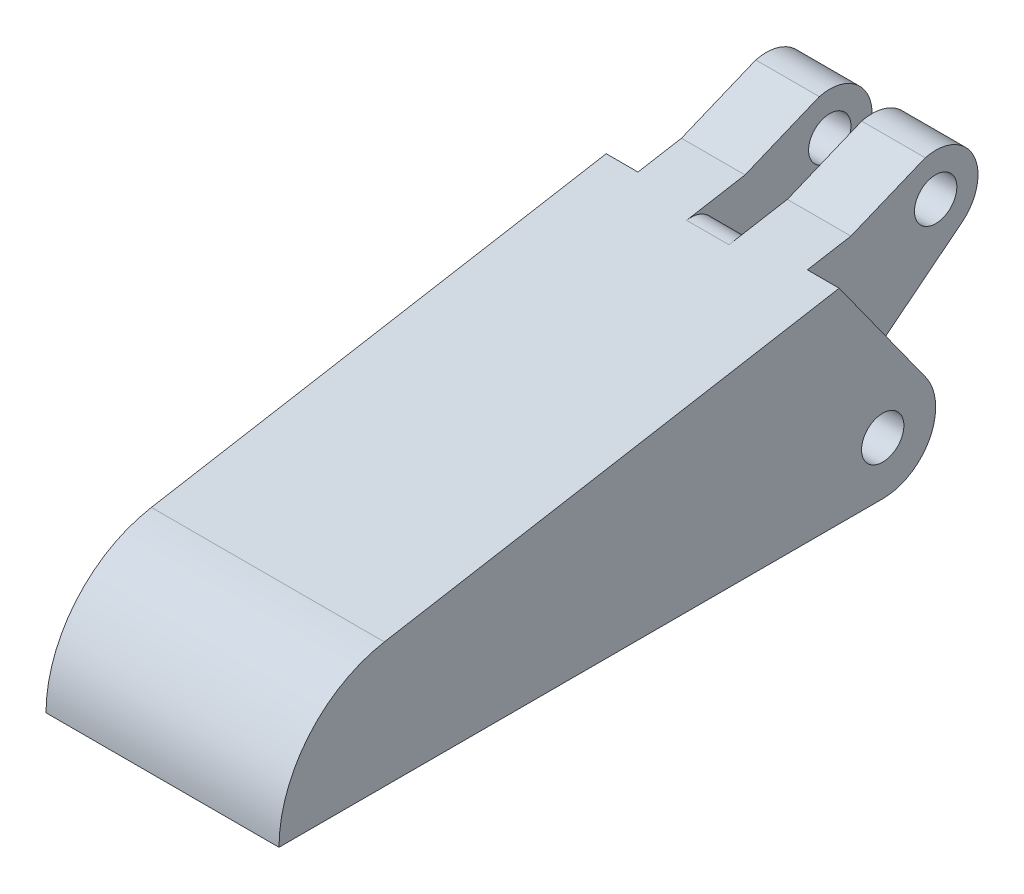
ISO-10303-21;
HEADER;
FILE_DESCRIPTION(('STEP AP214'),'2;1');
FILE_NAME('part.step','',(''),(''),'','','');
FILE_SCHEMA(('AUTOMOTIVE_DESIGN { 1 0 10303 214 1 1 1 1 }'));
ENDSEC;
DATA;
#1=APPLICATION_CONTEXT('core data for automotive mechanical design processes');
#2=APPLICATION_PROTOCOL_DEFINITION('international standard','automotive_design',2000,#1);
#3=PRODUCT_CONTEXT('',#1,'mechanical');
#4=PRODUCT('Part','Part','',(#3));
#5=PRODUCT_RELATED_PRODUCT_CATEGORY('part','',(#4));
#6=PRODUCT_DEFINITION_FORMATION('','',#4);
#7=PRODUCT_DEFINITION_CONTEXT('part definition',#1,'design');
#8=PRODUCT_DEFINITION('design','',#6,#7);
#9=PRODUCT_DEFINITION_SHAPE('','',#8);
#10=(LENGTH_UNIT() NAMED_UNIT(*) SI_UNIT(.MILLI.,.METRE.));
#11=(NAMED_UNIT(*) PLANE_ANGLE_UNIT() SI_UNIT($,.RADIAN.));
#12=(NAMED_UNIT(*) SI_UNIT($,.STERADIAN.) SOLID_ANGLE_UNIT());
#13=UNCERTAINTY_MEASURE_WITH_UNIT(LENGTH_MEASURE(1.E-05),#10,'distance_accuracy_value','');
#14=(GEOMETRIC_REPRESENTATION_CONTEXT(3) GLOBAL_UNCERTAINTY_ASSIGNED_CONTEXT((#13)) GLOBAL_UNIT_ASSIGNED_CONTEXT((#10,
#11,#12)) REPRESENTATION_CONTEXT('',''));
#15=CARTESIAN_POINT('',(0.,0.,0.));
#16=DIRECTION('',(0.,0.,1.));
#17=DIRECTION('',(1.,0.,0.));
#18=AXIS2_PLACEMENT_3D('',#15,#16,#17);
#19=CARTESIAN_POINT('',(3.,14.9837440028943,0.));
#20=DIRECTION('',(0.,0.924460532663595,0.381277751183231));
#21=DIRECTION('',(0.,-0.381277751183231,0.924460532663595));
#22=AXIS2_PLACEMENT_3D('',#19,#20,#21);
#23=PLANE('',#22);
#24=DIRECTION('',(1.,0.,0.));
#25=VECTOR('',#24,1.);
#26=CARTESIAN_POINT('',(3.,14.9837440028943,0.));
#27=LINE('',#26,#25);
#28=CARTESIAN_POINT('',(3.,14.9837440028943,0.));
#29=VERTEX_POINT('',#28);
#30=CARTESIAN_POINT('',(9.,14.9837440028943,0.));
#31=VERTEX_POINT('',#30);
#32=EDGE_CURVE('E295',#29,#31,#27,.T.);
#33=ORIENTED_EDGE('',*,*,#32,.T.);
#34=DIRECTION('',(0.,0.381277751183231,-0.924460532663595));
#35=VECTOR('',#34,1.);
#36=CARTESIAN_POINT('',(9.,14.9837440028943,0.));
#37=LINE('',#36,#35);
#38=CARTESIAN_POINT('',(9.,17.8766101294901,-7.01415320463333));
#39=VERTEX_POINT('',#38);
#40=EDGE_CURVE('E225',#31,#39,#37,.T.);
#41=ORIENTED_EDGE('',*,*,#40,.T.);
#42=DIRECTION('',(1.,0.,0.));
#43=VECTOR('',#42,1.);
#44=CARTESIAN_POINT('',(3.,17.8766101294901,-7.01415320463333));
#45=LINE('',#44,#43);
#46=CARTESIAN_POINT('',(3.,17.8766101294901,-7.01415320463333));
#47=VERTEX_POINT('',#46);
#48=EDGE_CURVE('E278',#47,#39,#45,.T.);
#49=ORIENTED_EDGE('',*,*,#48,.F.);
#50=DIRECTION('',(0.,-0.381277751183231,0.924460532663595));
#51=VECTOR('',#50,1.);
#52=CARTESIAN_POINT('',(3.,14.9837440028943,0.));
#53=LINE('',#52,#51);
#54=EDGE_CURVE('E259',#47,#29,#53,.T.);
#55=ORIENTED_EDGE('',*,*,#54,.T.);
#56=EDGE_LOOP('',(#33,#41,#49,#55));
#57=FACE_BOUND('',#56,.T.);
#58=ADVANCED_FACE('F44',(#57),#23,.T.);
#59=CARTESIAN_POINT('',(3.,14.,-8.));
#60=DIRECTION('',(1.,0.,0.));
#61=DIRECTION('',(0.,0.,-1.));
#62=AXIS2_PLACEMENT_3D('',#59,#60,#61);
#63=CYLINDRICAL_SURFACE('',#62,4.);
#64=ORIENTED_EDGE('',*,*,#48,.T.);
#65=CARTESIAN_POINT('',(9.,14.,-8.));
#66=DIRECTION('',(1.,0.,0.));
#67=DIRECTION('',(0.,0.,-1.));
#68=AXIS2_PLACEMENT_3D('',#65,#66,#67);
#69=CIRCLE('',#68,4.);
#70=CARTESIAN_POINT('',(9.,10.8656455942036,-10.4851202101437));
#71=VERTEX_POINT('',#70);
#72=EDGE_CURVE('E197',#71,#39,#69,.T.);
#73=ORIENTED_EDGE('',*,*,#72,.F.);
#74=DIRECTION('',(1.,0.,0.));
#75=VECTOR('',#74,1.);
#76=CARTESIAN_POINT('',(3.,10.8656455942036,-10.4851202101437));
#77=LINE('',#76,#75);
#78=CARTESIAN_POINT('',(3.,10.8656455942036,-10.4851202101437));
#79=VERTEX_POINT('',#78);
#80=EDGE_CURVE('E284',#79,#71,#77,.T.);
#81=ORIENTED_EDGE('',*,*,#80,.F.);
#82=CARTESIAN_POINT('',(3.,14.,-8.));
#83=DIRECTION('',(1.,0.,0.));
#84=DIRECTION('',(0.,0.,-1.));
#85=AXIS2_PLACEMENT_3D('',#82,#83,#84);
#86=CIRCLE('',#85,4.);
#87=EDGE_CURVE('E273',#79,#47,#86,.T.);
#88=ORIENTED_EDGE('',*,*,#87,.T.);
#89=EDGE_LOOP('',(#64,#73,#81,#88));
#90=FACE_BOUND('',#89,.T.);
#91=ADVANCED_FACE('F373',(#90),#63,.T.);
#92=CARTESIAN_POINT('',(3.,10.8656455942036,-10.4851202101437));
#93=DIRECTION('',(0.,-0.783588601449101,-0.621280052535926));
#94=DIRECTION('',(0.,0.621280052535926,-0.783588601449101));
#95=AXIS2_PLACEMENT_3D('',#92,#93,#94);
#96=PLANE('',#95);
#97=ORIENTED_EDGE('',*,*,#80,.T.);
#98=DIRECTION('',(0.,0.621280052535925,-0.783588601449101));
#99=VECTOR('',#98,1.);
#100=CARTESIAN_POINT('',(9.,10.8656455942036,-10.4851202101437));
#101=LINE('',#100,#99);
#102=CARTESIAN_POINT('',(9.,4.73290784629889,-2.75021326227114));
#103=VERTEX_POINT('',#102);
#104=EDGE_CURVE('E186',#103,#71,#101,.T.);
#105=ORIENTED_EDGE('',*,*,#104,.F.);
#106=DIRECTION('',(1.,0.,0.));
#107=VECTOR('',#106,1.);
#108=CARTESIAN_POINT('',(3.,4.73290784629889,-2.75021326227114));
#109=LINE('',#108,#107);
#110=CARTESIAN_POINT('',(3.,4.73290784629889,-2.75021326227114));
#111=VERTEX_POINT('',#110);
#112=EDGE_CURVE('E289',#111,#103,#109,.T.);
#113=ORIENTED_EDGE('',*,*,#112,.F.);
#114=DIRECTION('',(0.,0.621280052535926,-0.783588601449101));
#115=VECTOR('',#114,1.);
#116=CARTESIAN_POINT('',(3.,10.8656455942036,-10.4851202101437));
#117=LINE('',#116,#115);
#118=EDGE_CURVE('E70',#111,#79,#117,.T.);
#119=ORIENTED_EDGE('',*,*,#118,.T.);
#120=EDGE_LOOP('',(#97,#105,#113,#119));
#121=FACE_BOUND('',#120,.T.);
#122=ADVANCED_FACE('F362',(#121),#96,.T.);
#123=CARTESIAN_POINT('',(3.,14.,-8.));
#124=DIRECTION('',(1.,0.,0.));
#125=DIRECTION('',(0.,0.,-1.));
#126=AXIS2_PLACEMENT_3D('',#123,#124,#125);
#127=CYLINDRICAL_SURFACE('',#126,2.);
#128=CARTESIAN_POINT('',(3.,14.,-8.));
#129=DIRECTION('',(1.,0.,0.));
#130=DIRECTION('',(0.,0.,-1.));
#131=AXIS2_PLACEMENT_3D('',#128,#129,#130);
#132=CIRCLE('',#131,2.);
#133=CARTESIAN_POINT('',(3.,14.,-10.));
#134=VERTEX_POINT('',#133);
#135=EDGE_CURVE('E255',#134,#134,#132,.T.);
#136=ORIENTED_EDGE('',*,*,#135,.F.);
#137=EDGE_LOOP('',(#136));
#138=FACE_BOUND('',#137,.T.);
#139=CARTESIAN_POINT('',(9.,14.,-8.));
#140=DIRECTION('',(1.,0.,0.));
#141=DIRECTION('',(0.,0.,-1.));
#142=AXIS2_PLACEMENT_3D('',#139,#140,#141);
#143=CIRCLE('',#142,2.);
#144=CARTESIAN_POINT('',(9.,14.,-10.));
#145=VERTEX_POINT('',#144);
#146=EDGE_CURVE('E179',#145,#145,#143,.F.);
#147=ORIENTED_EDGE('',*,*,#146,.F.);
#148=EDGE_LOOP('',(#147));
#149=FACE_BOUND('',#148,.T.);
#150=ADVANCED_FACE('F359',(#138,#149),#127,.F.);
#151=CARTESIAN_POINT('',(22.,14.2713029002141,4.10781365998154));
#152=DIRECTION('',(0.,-0.583765439031886,0.811922356011897));
#153=DIRECTION('',(0.,-0.811922356011897,-0.583765439031886));
#154=AXIS2_PLACEMENT_3D('',#151,#152,#153);
#155=PLANE('',#154);
#156=DIRECTION('',(0.,-0.811922356011897,-0.583765439031886));
#157=VECTOR('',#156,1.);
#158=CARTESIAN_POINT('',(19.,4.73290784629889,-2.75021326227114));
#159=LINE('',#158,#157);
#160=CARTESIAN_POINT('',(19.,14.2713029002141,4.10781365998154));
#161=VERTEX_POINT('',#160);
#162=CARTESIAN_POINT('',(19.,4.73290784629889,-2.75021326227114));
#163=VERTEX_POINT('',#162);
#164=EDGE_CURVE('E243',#161,#163,#159,.T.);
#165=ORIENTED_EDGE('',*,*,#164,.F.);
#166=DIRECTION('',(-1.,0.,0.));
#167=VECTOR('',#166,1.);
#168=CARTESIAN_POINT('',(22.,14.2713029002141,4.10781365998154));
#169=LINE('',#168,#167);
#170=CARTESIAN_POINT('',(22.,14.2713029002141,4.10781365998154));
#171=VERTEX_POINT('',#170);
#172=EDGE_CURVE('E345',#171,#161,#169,.T.);
#173=ORIENTED_EDGE('',*,*,#172,.F.);
#174=DIRECTION('',(0.,0.811922356011895,0.583765439031889));
#175=VECTOR('',#174,1.);
#176=CARTESIAN_POINT('',(22.,2.75140008912451,-4.17490090296352));
#177=LINE('',#176,#175);
#178=CARTESIAN_POINT('',(22.,2.75140008912451,-4.17490090296352));
#179=VERTEX_POINT('',#178);
#180=EDGE_CURVE('E318',#179,#171,#177,.T.);
#181=ORIENTED_EDGE('',*,*,#180,.F.);
#182=DIRECTION('',(-1.,0.,0.));
#183=VECTOR('',#182,1.);
#184=CARTESIAN_POINT('',(22.,2.75140008912451,-4.17490090296352));
#185=LINE('',#184,#183);
#186=CARTESIAN_POINT('',(0.,2.75140008912451,-4.17490090296352));
#187=VERTEX_POINT('',#186);
#188=EDGE_CURVE('E349',#179,#187,#185,.T.);
#189=ORIENTED_EDGE('',*,*,#188,.T.);
#190=DIRECTION('',(0.,0.811922356011897,0.583765439031886));
#191=VECTOR('',#190,1.);
#192=CARTESIAN_POINT('',(0.,14.2713029002141,4.10781365998154));
#193=LINE('',#192,#191);
#194=CARTESIAN_POINT('',(0.,14.2713029002141,4.10781365998154));
#195=VERTEX_POINT('',#194);
#196=EDGE_CURVE('E335',#187,#195,#193,.T.);
#197=ORIENTED_EDGE('',*,*,#196,.T.);
#198=CARTESIAN_POINT('',(3.,14.2713029002141,4.10781365998154));
#199=VERTEX_POINT('',#198);
#200=EDGE_CURVE('E344',#199,#195,#169,.T.);
#201=ORIENTED_EDGE('',*,*,#200,.F.);
#202=DIRECTION('',(0.,-0.811922356011897,-0.583765439031886));
#203=VECTOR('',#202,1.);
#204=CARTESIAN_POINT('',(3.,4.73290784629889,-2.75021326227114));
#205=LINE('',#204,#203);
#206=EDGE_CURVE('E267',#199,#111,#205,.T.);
#207=ORIENTED_EDGE('',*,*,#206,.T.);
#208=ORIENTED_EDGE('',*,*,#112,.T.);
#209=CARTESIAN_POINT('',(13.,4.73290784629889,-2.75021326227114));
#210=VERTEX_POINT('',#209);
#211=EDGE_CURVE('E293',#103,#210,#109,.T.);
#212=ORIENTED_EDGE('',*,*,#211,.T.);
#213=EDGE_CURVE('E294',#210,#163,#109,.T.);
#214=ORIENTED_EDGE('',*,*,#213,.T.);
#215=EDGE_LOOP('',(#165,#173,#181,#189,#197,#201,#207,#208,#212,#214));
#216=FACE_BOUND('',#215,.T.);
#217=ADVANCED_FACE('F361',(#216),#155,.F.);
#218=CARTESIAN_POINT('',(22.,-5.,45.));
#219=DIRECTION('',(1.,0.,0.));
#220=DIRECTION('',(0.,0.,-1.));
#221=AXIS2_PLACEMENT_3D('',#218,#219,#220);
#222=PLANE('',#221);
#223=CARTESIAN_POINT('',(22.,-5.,45.));
#224=DIRECTION('',(1.,0.,0.));
#225=DIRECTION('',(0.,0.,-1.));
#226=AXIS2_PLACEMENT_3D('',#223,#224,#225);
#227=CIRCLE('',#226,12.);
#228=CARTESIAN_POINT('',(22.,6.82349272557851,47.0506144855121));
#229=VERTEX_POINT('',#228);
#230=CARTESIAN_POINT('',(22.,-5.,57.));
#231=VERTEX_POINT('',#230);
#232=EDGE_CURVE('E307',#229,#231,#227,.T.);
#233=ORIENTED_EDGE('',*,*,#232,.T.);
#234=DIRECTION('',(0.,0.,-1.));
#235=VECTOR('',#234,1.);
#236=CARTESIAN_POINT('',(22.,-5.,0.));
#237=LINE('',#236,#235);
#238=CARTESIAN_POINT('',(22.,-5.,0.));
#239=VERTEX_POINT('',#238);
#240=EDGE_CURVE('E311',#231,#239,#237,.T.);
#241=ORIENTED_EDGE('',*,*,#240,.T.);
#242=CARTESIAN_POINT('',(22.,0.,0.));
#243=DIRECTION('',(1.,0.,0.));
#244=DIRECTION('',(0.,0.,-1.));
#245=AXIS2_PLACEMENT_3D('',#242,#243,#244);
#246=CIRCLE('',#245,5.);
#247=EDGE_CURVE('E315',#239,#179,#246,.T.);
#248=ORIENTED_EDGE('',*,*,#247,.T.);
#249=ORIENTED_EDGE('',*,*,#180,.T.);
#250=DIRECTION('',(0.,-0.170884540459342,0.985291060464876));
#251=VECTOR('',#250,1.);
#252=CARTESIAN_POINT('',(22.,6.82349272557851,47.0506144855121));
#253=LINE('',#252,#251);
#254=EDGE_CURVE('E321',#171,#229,#253,.T.);
#255=ORIENTED_EDGE('',*,*,#254,.T.);
#256=EDGE_LOOP('',(#233,#241,#248,#249,#255));
#257=FACE_BOUND('',#256,.T.);
#258=CARTESIAN_POINT('',(22.,0.,0.));
#259=DIRECTION('',(1.,0.,0.));
#260=DIRECTION('',(0.,0.,-1.));
#261=AXIS2_PLACEMENT_3D('',#258,#259,#260);
#262=CIRCLE('',#261,2.);
#263=CARTESIAN_POINT('',(22.,0.,-2.));
#264=VERTEX_POINT('',#263);
#265=EDGE_CURVE('E299',#264,#264,#262,.T.);
#266=ORIENTED_EDGE('',*,*,#265,.F.);
#267=EDGE_LOOP('',(#266));
#268=FACE_BOUND('',#267,.T.);
#269=ADVANCED_FACE('F370',(#257,#268),#222,.T.);
#270=CARTESIAN_POINT('',(0.,-5.,45.));
#271=DIRECTION('',(1.,0.,0.));
#272=DIRECTION('',(0.,0.,-1.));
#273=AXIS2_PLACEMENT_3D('',#270,#271,#272);
#274=PLANE('',#273);
#275=CARTESIAN_POINT('',(0.,-5.,45.));
#276=DIRECTION('',(1.,0.,0.));
#277=DIRECTION('',(0.,0.,-1.));
#278=AXIS2_PLACEMENT_3D('',#275,#276,#277);
#279=CIRCLE('',#278,12.);
#280=CARTESIAN_POINT('',(0.,6.82349272557851,47.0506144855121));
#281=VERTEX_POINT('',#280);
#282=CARTESIAN_POINT('',(0.,-5.,57.));
#283=VERTEX_POINT('',#282);
#284=EDGE_CURVE('E303',#281,#283,#279,.T.);
#285=ORIENTED_EDGE('',*,*,#284,.F.);
#286=DIRECTION('',(0.,-0.170884540459342,0.985291060464876));
#287=VECTOR('',#286,1.);
#288=CARTESIAN_POINT('',(0.,6.82349272557851,47.0506144855121));
#289=LINE('',#288,#287);
#290=EDGE_CURVE('E312',#195,#281,#289,.T.);
#291=ORIENTED_EDGE('',*,*,#290,.F.);
#292=ORIENTED_EDGE('',*,*,#196,.F.);
#293=CARTESIAN_POINT('',(0.,0.,0.));
#294=DIRECTION('',(1.,0.,0.));
#295=DIRECTION('',(0.,0.,-1.));
#296=AXIS2_PLACEMENT_3D('',#293,#294,#295);
#297=CIRCLE('',#296,5.);
#298=CARTESIAN_POINT('',(0.,-5.,0.));
#299=VERTEX_POINT('',#298);
#300=EDGE_CURVE('E331',#299,#187,#297,.T.);
#301=ORIENTED_EDGE('',*,*,#300,.F.);
#302=DIRECTION('',(0.,0.,-1.));
#303=VECTOR('',#302,1.);
#304=CARTESIAN_POINT('',(0.,-5.,0.));
#305=LINE('',#304,#303);
#306=EDGE_CURVE('E328',#283,#299,#305,.T.);
#307=ORIENTED_EDGE('',*,*,#306,.F.);
#308=EDGE_LOOP('',(#285,#291,#292,#301,#307));
#309=FACE_BOUND('',#308,.T.);
#310=CARTESIAN_POINT('',(0.,0.,0.));
#311=DIRECTION('',(1.,0.,0.));
#312=DIRECTION('',(0.,0.,-1.));
#313=AXIS2_PLACEMENT_3D('',#310,#311,#312);
#314=CIRCLE('',#313,2.);
#315=CARTESIAN_POINT('',(0.,0.,-2.));
#316=VERTEX_POINT('',#315);
#317=EDGE_CURVE('E282',#316,#316,#314,.T.);
#318=ORIENTED_EDGE('',*,*,#317,.T.);
#319=EDGE_LOOP('',(#318));
#320=FACE_BOUND('',#319,.T.);
#321=ADVANCED_FACE('F469',(#309,#320),#274,.F.);
#322=CARTESIAN_POINT('',(22.,-5.,45.));
#323=DIRECTION('',(-1.,0.,0.));
#324=DIRECTION('',(0.,0.,1.));
#325=AXIS2_PLACEMENT_3D('',#322,#323,#324);
#326=CYLINDRICAL_SURFACE('',#325,12.);
#327=ORIENTED_EDGE('',*,*,#284,.T.);
#328=DIRECTION('',(-1.,0.,0.));
#329=VECTOR('',#328,1.);
#330=CARTESIAN_POINT('',(22.,-5.,57.));
#331=LINE('',#330,#329);
#332=EDGE_CURVE('E11',#231,#283,#331,.T.);
#333=ORIENTED_EDGE('',*,*,#332,.F.);
#334=ORIENTED_EDGE('',*,*,#232,.F.);
#335=DIRECTION('',(-1.,0.,0.));
#336=VECTOR('',#335,1.);
#337=CARTESIAN_POINT('',(22.,6.82349272557851,47.0506144855121));
#338=LINE('',#337,#336);
#339=EDGE_CURVE('E324',#229,#281,#338,.T.);
#340=ORIENTED_EDGE('',*,*,#339,.T.);
#341=EDGE_LOOP('',(#327,#333,#334,#340));
#342=FACE_BOUND('',#341,.T.);
#343=ADVANCED_FACE('F46',(#342),#326,.T.);
#344=CARTESIAN_POINT('',(22.,-5.,0.));
#345=DIRECTION('',(0.,1.,0.));
#346=DIRECTION('',(0.,0.,1.));
#347=AXIS2_PLACEMENT_3D('',#344,#345,#346);
#348=PLANE('',#347);
#349=ORIENTED_EDGE('',*,*,#306,.T.);
#350=DIRECTION('',(-1.,0.,0.));
#351=VECTOR('',#350,1.);
#352=CARTESIAN_POINT('',(22.,-5.,0.));
#353=LINE('',#352,#351);
#354=EDGE_CURVE('E54',#239,#299,#353,.T.);
#355=ORIENTED_EDGE('',*,*,#354,.F.);
#356=ORIENTED_EDGE('',*,*,#240,.F.);
#357=ORIENTED_EDGE('',*,*,#332,.T.);
#358=EDGE_LOOP('',(#349,#355,#356,#357));
#359=FACE_BOUND('',#358,.T.);
#360=ADVANCED_FACE('F483',(#359),#348,.F.);
#361=CARTESIAN_POINT('',(22.,0.,0.));
#362=DIRECTION('',(-1.,0.,0.));
#363=DIRECTION('',(0.,0.,1.));
#364=AXIS2_PLACEMENT_3D('',#361,#362,#363);
#365=CYLINDRICAL_SURFACE('',#364,5.);
#366=ORIENTED_EDGE('',*,*,#300,.T.);
#367=ORIENTED_EDGE('',*,*,#188,.F.);
#368=ORIENTED_EDGE('',*,*,#247,.F.);
#369=ORIENTED_EDGE('',*,*,#354,.T.);
#370=EDGE_LOOP('',(#366,#367,#368,#369));
#371=FACE_BOUND('',#370,.T.);
#372=ADVANCED_FACE('F481',(#371),#365,.T.);
#373=CARTESIAN_POINT('',(22.,6.82349272557851,47.0506144855121));
#374=DIRECTION('',(0.,-0.985291060464876,-0.170884540459342));
#375=DIRECTION('',(0.,0.170884540459342,-0.985291060464876));
#376=AXIS2_PLACEMENT_3D('',#373,#374,#375);
#377=PLANE('',#376);
#378=CARTESIAN_POINT('',(13.,14.9837440028943,0.));
#379=VERTEX_POINT('',#378);
#380=CARTESIAN_POINT('',(19.,14.9837440028943,0.));
#381=VERTEX_POINT('',#380);
#382=EDGE_CURVE('E277',#379,#381,#27,.T.);
#383=ORIENTED_EDGE('',*,*,#382,.F.);
#384=DIRECTION('',(0.,-0.170884540459326,0.985291060464878));
#385=VECTOR('',#384,1.);
#386=CARTESIAN_POINT('',(13.,14.4433747998185,3.11567648957611));
#387=LINE('',#386,#385);
#388=CARTESIAN_POINT('',(13.,14.0274833718649,5.51363539788457));
#389=VERTEX_POINT('',#388);
#390=EDGE_CURVE('E216',#379,#389,#387,.T.);
#391=ORIENTED_EDGE('',*,*,#390,.T.);
#392=DIRECTION('',(-1.,0.,0.));
#393=VECTOR('',#392,1.);
#394=CARTESIAN_POINT('',(13.,14.0274833718649,5.51363539788457));
#395=LINE('',#394,#393);
#396=CARTESIAN_POINT('',(9.,14.0274833718649,5.51363539788457));
#397=VERTEX_POINT('',#396);
#398=EDGE_CURVE('E220',#389,#397,#395,.T.);
#399=ORIENTED_EDGE('',*,*,#398,.T.);
#400=DIRECTION('',(0.,-0.170884540459326,0.985291060464878));
#401=VECTOR('',#400,1.);
#402=CARTESIAN_POINT('',(9.,14.4433747998185,3.11567648957611));
#403=LINE('',#402,#401);
#404=EDGE_CURVE('E191',#31,#397,#403,.T.);
#405=ORIENTED_EDGE('',*,*,#404,.F.);
#406=ORIENTED_EDGE('',*,*,#32,.F.);
#407=DIRECTION('',(0.,-0.170884540459325,0.985291060464879));
#408=VECTOR('',#407,1.);
#409=CARTESIAN_POINT('',(3.,14.2713029002141,4.10781365998154));
#410=LINE('',#409,#408);
#411=EDGE_CURVE('E263',#29,#199,#410,.T.);
#412=ORIENTED_EDGE('',*,*,#411,.T.);
#413=ORIENTED_EDGE('',*,*,#200,.T.);
#414=ORIENTED_EDGE('',*,*,#290,.T.);
#415=ORIENTED_EDGE('',*,*,#339,.F.);
#416=ORIENTED_EDGE('',*,*,#254,.F.);
#417=ORIENTED_EDGE('',*,*,#172,.T.);
#418=DIRECTION('',(0.,-0.170884540459325,0.985291060464879));
#419=VECTOR('',#418,1.);
#420=CARTESIAN_POINT('',(19.,14.2713029002141,4.10781365998154));
#421=LINE('',#420,#419);
#422=EDGE_CURVE('E240',#381,#161,#421,.T.);
#423=ORIENTED_EDGE('',*,*,#422,.F.);
#424=EDGE_LOOP('',(#383,#391,#399,#405,#406,#412,#413,#414,#415,#416,#417,#423));
#425=FACE_BOUND('',#424,.T.);
#426=ADVANCED_FACE('F405',(#425),#377,.F.);
#427=CARTESIAN_POINT('',(22.,0.,0.));
#428=DIRECTION('',(-1.,0.,0.));
#429=DIRECTION('',(0.,0.,1.));
#430=AXIS2_PLACEMENT_3D('',#427,#428,#429);
#431=CYLINDRICAL_SURFACE('',#430,2.);
#432=ORIENTED_EDGE('',*,*,#265,.T.);
#433=EDGE_LOOP('',(#432));
#434=FACE_BOUND('',#433,.T.);
#435=ORIENTED_EDGE('',*,*,#317,.F.);
#436=EDGE_LOOP('',(#435));
#437=FACE_BOUND('',#436,.T.);
#438=ADVANCED_FACE('F397',(#434,#437),#431,.F.);
#439=DIRECTION('',(0.,0.381277751183231,-0.924460532663595));
#440=VECTOR('',#439,1.);
#441=CARTESIAN_POINT('',(13.,14.9837440028943,0.));
#442=LINE('',#441,#440);
#443=CARTESIAN_POINT('',(13.,17.8766101294901,-7.01415320463333));
#444=VERTEX_POINT('',#443);
#445=EDGE_CURVE('E229',#379,#444,#442,.T.);
#446=ORIENTED_EDGE('',*,*,#445,.F.);
#447=ORIENTED_EDGE('',*,*,#382,.T.);
#448=DIRECTION('',(0.,-0.381277751183231,0.924460532663595));
#449=VECTOR('',#448,1.);
#450=CARTESIAN_POINT('',(19.,14.9837440028943,0.));
#451=LINE('',#450,#449);
#452=CARTESIAN_POINT('',(19.,17.8766101294901,-7.01415320463333));
#453=VERTEX_POINT('',#452);
#454=EDGE_CURVE('E236',#453,#381,#451,.T.);
#455=ORIENTED_EDGE('',*,*,#454,.F.);
#456=EDGE_CURVE('E283',#444,#453,#45,.T.);
#457=ORIENTED_EDGE('',*,*,#456,.F.);
#458=EDGE_LOOP('',(#446,#447,#455,#457));
#459=FACE_BOUND('',#458,.T.);
#460=ADVANCED_FACE('F387',(#459),#23,.T.);
#461=CARTESIAN_POINT('',(13.,14.,-8.));
#462=DIRECTION('',(1.,0.,0.));
#463=DIRECTION('',(0.,0.,-1.));
#464=AXIS2_PLACEMENT_3D('',#461,#462,#463);
#465=CIRCLE('',#464,4.);
#466=CARTESIAN_POINT('',(13.,10.8656455942036,-10.4851202101437));
#467=VERTEX_POINT('',#466);
#468=EDGE_CURVE('E212',#467,#444,#465,.T.);
#469=ORIENTED_EDGE('',*,*,#468,.T.);
#470=ORIENTED_EDGE('',*,*,#456,.T.);
#471=CARTESIAN_POINT('',(19.,14.,-8.));
#472=DIRECTION('',(1.,0.,0.));
#473=DIRECTION('',(0.,0.,-1.));
#474=AXIS2_PLACEMENT_3D('',#471,#472,#473);
#475=CIRCLE('',#474,4.);
#476=CARTESIAN_POINT('',(19.,10.8656455942036,-10.4851202101437));
#477=VERTEX_POINT('',#476);
#478=EDGE_CURVE('E251',#477,#453,#475,.T.);
#479=ORIENTED_EDGE('',*,*,#478,.F.);
#480=EDGE_CURVE('E288',#467,#477,#77,.T.);
#481=ORIENTED_EDGE('',*,*,#480,.F.);
#482=EDGE_LOOP('',(#469,#470,#479,#481));
#483=FACE_BOUND('',#482,.T.);
#484=ADVANCED_FACE('F394',(#483),#63,.T.);
#485=DIRECTION('',(0.,0.621280052535925,-0.783588601449101));
#486=VECTOR('',#485,1.);
#487=CARTESIAN_POINT('',(13.,10.8656455942036,-10.4851202101437));
#488=LINE('',#487,#486);
#489=EDGE_CURVE('E207',#210,#467,#488,.T.);
#490=ORIENTED_EDGE('',*,*,#489,.T.);
#491=ORIENTED_EDGE('',*,*,#480,.T.);
#492=DIRECTION('',(0.,0.621280052535926,-0.783588601449101));
#493=VECTOR('',#492,1.);
#494=CARTESIAN_POINT('',(19.,10.8656455942036,-10.4851202101437));
#495=LINE('',#494,#493);
#496=EDGE_CURVE('E247',#163,#477,#495,.T.);
#497=ORIENTED_EDGE('',*,*,#496,.F.);
#498=ORIENTED_EDGE('',*,*,#213,.F.);
#499=EDGE_LOOP('',(#490,#491,#497,#498));
#500=FACE_BOUND('',#499,.T.);
#501=ADVANCED_FACE('F376',(#500),#96,.T.);
#502=CARTESIAN_POINT('',(3.,14.,-8.));
#503=DIRECTION('',(1.,0.,0.));
#504=DIRECTION('',(0.,0.,-1.));
#505=AXIS2_PLACEMENT_3D('',#502,#503,#504);
#506=PLANE('',#505);
#507=ORIENTED_EDGE('',*,*,#135,.T.);
#508=EDGE_LOOP('',(#507));
#509=FACE_BOUND('',#508,.T.);
#510=ORIENTED_EDGE('',*,*,#54,.F.);
#511=ORIENTED_EDGE('',*,*,#87,.F.);
#512=ORIENTED_EDGE('',*,*,#118,.F.);
#513=ORIENTED_EDGE('',*,*,#206,.F.);
#514=ORIENTED_EDGE('',*,*,#411,.F.);
#515=EDGE_LOOP('',(#510,#511,#512,#513,#514));
#516=FACE_BOUND('',#515,.T.);
#517=ADVANCED_FACE('F382',(#509,#516),#506,.F.);
#518=CARTESIAN_POINT('',(13.,14.,-8.));
#519=DIRECTION('',(1.,0.,0.));
#520=DIRECTION('',(0.,0.,-1.));
#521=AXIS2_PLACEMENT_3D('',#518,#519,#520);
#522=CIRCLE('',#521,2.);
#523=CARTESIAN_POINT('',(13.,14.,-10.));
#524=VERTEX_POINT('',#523);
#525=EDGE_CURVE('E48',#524,#524,#522,.F.);
#526=ORIENTED_EDGE('',*,*,#525,.T.);
#527=EDGE_LOOP('',(#526));
#528=FACE_BOUND('',#527,.T.);
#529=CARTESIAN_POINT('',(19.,14.,-8.));
#530=DIRECTION('',(1.,0.,0.));
#531=DIRECTION('',(0.,0.,-1.));
#532=AXIS2_PLACEMENT_3D('',#529,#530,#531);
#533=CIRCLE('',#532,2.);
#534=CARTESIAN_POINT('',(19.,14.,-10.));
#535=VERTEX_POINT('',#534);
#536=EDGE_CURVE('E232',#535,#535,#533,.T.);
#537=ORIENTED_EDGE('',*,*,#536,.T.);
#538=EDGE_LOOP('',(#537));
#539=FACE_BOUND('',#538,.T.);
#540=ADVANCED_FACE('F365',(#528,#539),#127,.F.);
#541=CARTESIAN_POINT('',(19.,14.,-8.));
#542=DIRECTION('',(1.,0.,0.));
#543=DIRECTION('',(0.,0.,-1.));
#544=AXIS2_PLACEMENT_3D('',#541,#542,#543);
#545=PLANE('',#544);
#546=ORIENTED_EDGE('',*,*,#454,.T.);
#547=ORIENTED_EDGE('',*,*,#422,.T.);
#548=ORIENTED_EDGE('',*,*,#164,.T.);
#549=ORIENTED_EDGE('',*,*,#496,.T.);
#550=ORIENTED_EDGE('',*,*,#478,.T.);
#551=EDGE_LOOP('',(#546,#547,#548,#549,#550));
#552=FACE_BOUND('',#551,.T.);
#553=ORIENTED_EDGE('',*,*,#536,.F.);
#554=EDGE_LOOP('',(#553));
#555=FACE_BOUND('',#554,.T.);
#556=ADVANCED_FACE('F381',(#552,#555),#545,.T.);
#557=CARTESIAN_POINT('',(13.,10.8656455942036,-10.4851202101437));
#558=DIRECTION('',(0.,0.783588601449101,0.621280052535925));
#559=DIRECTION('',(0.,-0.621280052535926,0.783588601449101));
#560=AXIS2_PLACEMENT_3D('',#557,#558,#559);
#561=PLANE('',#560);
#562=ORIENTED_EDGE('',*,*,#211,.F.);
#563=CARTESIAN_POINT('',(9.,4.4164460701704,-2.35107628763879));
#564=VERTEX_POINT('',#563);
#565=EDGE_CURVE('E62',#564,#103,#101,.T.);
#566=ORIENTED_EDGE('',*,*,#565,.F.);
#567=DIRECTION('',(-1.,0.,0.));
#568=VECTOR('',#567,1.);
#569=CARTESIAN_POINT('',(13.,4.4164460701704,-2.35107628763879));
#570=LINE('',#569,#568);
#571=CARTESIAN_POINT('',(13.,4.4164460701704,-2.35107628763879));
#572=VERTEX_POINT('',#571);
#573=EDGE_CURVE('E180',#572,#564,#570,.T.);
#574=ORIENTED_EDGE('',*,*,#573,.F.);
#575=EDGE_CURVE('E208',#572,#210,#488,.T.);
#576=ORIENTED_EDGE('',*,*,#575,.T.);
#577=EDGE_LOOP('',(#562,#566,#574,#576));
#578=FACE_BOUND('',#577,.T.);
#579=ADVANCED_FACE('F423',(#578),#561,.T.);
#580=CARTESIAN_POINT('',(13.,11.687584575734,5.10781365998154));
#581=DIRECTION('',(1.,0.,0.));
#582=DIRECTION('',(0.,0.,-1.));
#583=AXIS2_PLACEMENT_3D('',#580,#581,#582);
#584=PLANE('',#583);
#585=ORIENTED_EDGE('',*,*,#445,.T.);
#586=ORIENTED_EDGE('',*,*,#468,.F.);
#587=ORIENTED_EDGE('',*,*,#489,.F.);
#588=ORIENTED_EDGE('',*,*,#575,.F.);
#589=CARTESIAN_POINT('',(13.,14.,-8.));
#590=DIRECTION('',(1.,0.,0.));
#591=DIRECTION('',(0.,0.,-1.));
#592=AXIS2_PLACEMENT_3D('',#589,#590,#591);
#593=CIRCLE('',#592,11.1245154965971);
#594=CARTESIAN_POINT('',(13.,12.9084592174307,3.07083482642646));
#595=VERTEX_POINT('',#594);
#596=EDGE_CURVE('E204',#595,#572,#593,.T.);
#597=ORIENTED_EDGE('',*,*,#596,.F.);
#598=CARTESIAN_POINT('',(13.,11.687584575734,5.10781365998154));
#599=DIRECTION('',(-1.,0.,0.));
#600=DIRECTION('',(0.,0.,-1.));
#601=AXIS2_PLACEMENT_3D('',#598,#599,#600);
#602=CIRCLE('',#601,2.37483002741027);
#603=EDGE_CURVE('E176',#389,#595,#602,.T.);
#604=ORIENTED_EDGE('',*,*,#603,.F.);
#605=ORIENTED_EDGE('',*,*,#390,.F.);
#606=EDGE_LOOP('',(#585,#586,#587,#588,#597,#604,#605));
#607=FACE_BOUND('',#606,.T.);
#608=ORIENTED_EDGE('',*,*,#525,.F.);
#609=EDGE_LOOP('',(#608));
#610=FACE_BOUND('',#609,.T.);
#611=ADVANCED_FACE('F413',(#607,#610),#584,.F.);
#612=CARTESIAN_POINT('',(9.,11.687584575734,5.10781365998154));
#613=DIRECTION('',(1.,0.,0.));
#614=DIRECTION('',(0.,0.,-1.));
#615=AXIS2_PLACEMENT_3D('',#612,#613,#614);
#616=PLANE('',#615);
#617=ORIENTED_EDGE('',*,*,#40,.F.);
#618=ORIENTED_EDGE('',*,*,#404,.T.);
#619=CARTESIAN_POINT('',(9.,11.687584575734,5.10781365998154));
#620=DIRECTION('',(-1.,0.,0.));
#621=DIRECTION('',(0.,0.,-1.));
#622=AXIS2_PLACEMENT_3D('',#619,#620,#621);
#623=CIRCLE('',#622,2.37483002741027);
#624=CARTESIAN_POINT('',(9.,12.9084592174307,3.07083482642646));
#625=VERTEX_POINT('',#624);
#626=EDGE_CURVE('E173',#397,#625,#623,.T.);
#627=ORIENTED_EDGE('',*,*,#626,.T.);
#628=CARTESIAN_POINT('',(9.,14.,-8.));
#629=DIRECTION('',(1.,0.,0.));
#630=DIRECTION('',(0.,0.,-1.));
#631=AXIS2_PLACEMENT_3D('',#628,#629,#630);
#632=CIRCLE('',#631,11.1245154965971);
#633=EDGE_CURVE('E182',#625,#564,#632,.T.);
#634=ORIENTED_EDGE('',*,*,#633,.T.);
#635=ORIENTED_EDGE('',*,*,#565,.T.);
#636=ORIENTED_EDGE('',*,*,#104,.T.);
#637=ORIENTED_EDGE('',*,*,#72,.T.);
#638=EDGE_LOOP('',(#617,#618,#627,#634,#635,#636,#637));
#639=FACE_BOUND('',#638,.T.);
#640=ORIENTED_EDGE('',*,*,#146,.T.);
#641=EDGE_LOOP('',(#640));
#642=FACE_BOUND('',#641,.T.);
#643=ADVANCED_FACE('F188',(#639,#642),#616,.T.);
#644=CARTESIAN_POINT('',(13.,11.687584575734,5.10781365998154));
#645=DIRECTION('',(-1.,0.,0.));
#646=DIRECTION('',(0.,0.,1.));
#647=AXIS2_PLACEMENT_3D('',#644,#645,#646);
#648=CYLINDRICAL_SURFACE('',#647,2.37483002741027);
#649=ORIENTED_EDGE('',*,*,#398,.F.);
#650=ORIENTED_EDGE('',*,*,#603,.T.);
#651=DIRECTION('',(-1.,0.,0.));
#652=VECTOR('',#651,1.);
#653=CARTESIAN_POINT('',(13.,12.9084592174307,3.07083482642646));
#654=LINE('',#653,#652);
#655=EDGE_CURVE('E169',#595,#625,#654,.T.);
#656=ORIENTED_EDGE('',*,*,#655,.T.);
#657=ORIENTED_EDGE('',*,*,#626,.F.);
#658=EDGE_LOOP('',(#649,#650,#656,#657));
#659=FACE_BOUND('',#658,.T.);
#660=ADVANCED_FACE('F171',(#659),#648,.T.);
#661=CARTESIAN_POINT('',(13.,14.,-8.));
#662=DIRECTION('',(-1.,0.,0.));
#663=DIRECTION('',(0.,0.,1.));
#664=AXIS2_PLACEMENT_3D('',#661,#662,#663);
#665=CYLINDRICAL_SURFACE('',#664,11.1245154965971);
#666=ORIENTED_EDGE('',*,*,#655,.F.);
#667=ORIENTED_EDGE('',*,*,#596,.T.);
#668=ORIENTED_EDGE('',*,*,#573,.T.);
#669=ORIENTED_EDGE('',*,*,#633,.F.);
#670=EDGE_LOOP('',(#666,#667,#668,#669));
#671=FACE_BOUND('',#670,.T.);
#672=ADVANCED_FACE('F183',(#671),#665,.F.);
#673=CLOSED_SHELL('',(#58,#91,#122,#150,#217,#269,#321,#343,#360,#372,#426,#438,#460,#484,#501,
#517,#540,#556,#579,#611,#643,#660,#672));
#674=MANIFOLD_SOLID_BREP('B2',#673);
#675=ADVANCED_BREP_SHAPE_REPRESENTATION('',(#18,#674),#14);
#676=SHAPE_DEFINITION_REPRESENTATION(#9,#675);
ENDSEC;
END-ISO-10303-21;
